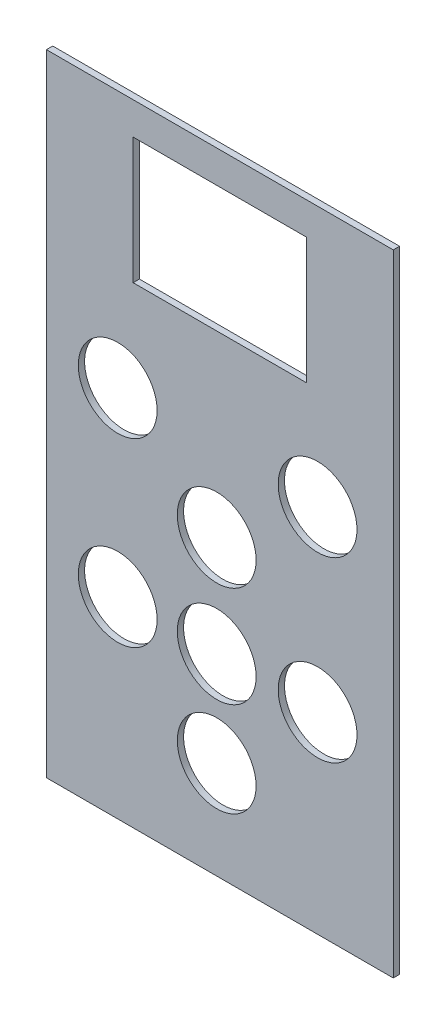
ISO-10303-21;
HEADER;
FILE_DESCRIPTION(('STEP AP214'),'2;1');
FILE_NAME('part.step','',(''),(''),'','','');
FILE_SCHEMA(('AUTOMOTIVE_DESIGN { 1 0 10303 214 1 1 1 1 }'));
ENDSEC;
DATA;
#1=APPLICATION_CONTEXT('core data for automotive mechanical design processes');
#2=APPLICATION_PROTOCOL_DEFINITION('international standard','automotive_design',2000,#1);
#3=PRODUCT_CONTEXT('',#1,'mechanical');
#4=PRODUCT('Part','Part','',(#3));
#5=PRODUCT_RELATED_PRODUCT_CATEGORY('part','',(#4));
#6=PRODUCT_DEFINITION_FORMATION('','',#4);
#7=PRODUCT_DEFINITION_CONTEXT('part definition',#1,'design');
#8=PRODUCT_DEFINITION('design','',#6,#7);
#9=PRODUCT_DEFINITION_SHAPE('','',#8);
#10=(LENGTH_UNIT() NAMED_UNIT(*) SI_UNIT(.MILLI.,.METRE.));
#11=(NAMED_UNIT(*) PLANE_ANGLE_UNIT() SI_UNIT($,.RADIAN.));
#12=(NAMED_UNIT(*) SI_UNIT($,.STERADIAN.) SOLID_ANGLE_UNIT());
#13=UNCERTAINTY_MEASURE_WITH_UNIT(LENGTH_MEASURE(1.E-05),#10,'distance_accuracy_value','');
#14=(GEOMETRIC_REPRESENTATION_CONTEXT(3) GLOBAL_UNCERTAINTY_ASSIGNED_CONTEXT((#13)) GLOBAL_UNIT_ASSIGNED_CONTEXT((#10,
#11,#12)) REPRESENTATION_CONTEXT('',''));
#15=CARTESIAN_POINT('',(0.,0.,0.));
#16=DIRECTION('',(0.,0.,1.));
#17=DIRECTION('',(1.,0.,0.));
#18=AXIS2_PLACEMENT_3D('',#15,#16,#17);
#19=CARTESIAN_POINT('',(0.,0.,1.));
#20=DIRECTION('',(0.,0.,1.));
#21=DIRECTION('',(1.,0.,0.));
#22=AXIS2_PLACEMENT_3D('',#19,#20,#21);
#23=PLANE('',#22);
#24=CARTESIAN_POINT('',(53.4181818181818,-38.2515151515152,1.));
#25=DIRECTION('',(0.,0.,1.));
#26=DIRECTION('',(1.,0.,0.));
#27=AXIS2_PLACEMENT_3D('',#24,#25,#26);
#28=CIRCLE('',#27,6.25);
#29=CARTESIAN_POINT('',(59.6681818181818,-38.2515151515152,1.));
#30=VERTEX_POINT('',#29);
#31=EDGE_CURVE('E302',#30,#30,#28,.T.);
#32=ORIENTED_EDGE('',*,*,#31,.F.);
#33=EDGE_LOOP('',(#32));
#34=FACE_BOUND('',#33,.T.);
#35=CARTESIAN_POINT('',(53.4181818181818,-66.4515151515152,1.));
#36=DIRECTION('',(0.,0.,1.));
#37=DIRECTION('',(1.,0.,0.));
#38=AXIS2_PLACEMENT_3D('',#35,#36,#37);
#39=CIRCLE('',#38,6.25000000000001);
#40=CARTESIAN_POINT('',(59.6681818181818,-66.4515151515152,1.));
#41=VERTEX_POINT('',#40);
#42=EDGE_CURVE('E318',#41,#41,#39,.T.);
#43=ORIENTED_EDGE('',*,*,#42,.F.);
#44=EDGE_LOOP('',(#43));
#45=FACE_BOUND('',#44,.T.);
#46=CARTESIAN_POINT('',(37.4181818181818,-66.4515151515152,1.));
#47=DIRECTION('',(0.,0.,1.));
#48=DIRECTION('',(1.,0.,0.));
#49=AXIS2_PLACEMENT_3D('',#46,#47,#48);
#50=CIRCLE('',#49,6.25000000000001);
#51=CARTESIAN_POINT('',(43.6681818181818,-66.4515151515152,1.));
#52=VERTEX_POINT('',#51);
#53=EDGE_CURVE('E140',#52,#52,#50,.T.);
#54=ORIENTED_EDGE('',*,*,#53,.F.);
#55=EDGE_LOOP('',(#54));
#56=FACE_BOUND('',#55,.T.);
#57=DIRECTION('',(0.,-1.,0.));
#58=VECTOR('',#57,1.);
#59=CARTESIAN_POINT('',(10.4181818181818,3.04848484848485,1.));
#60=LINE('',#59,#58);
#61=CARTESIAN_POINT('',(10.4181818181818,3.04848484848485,1.));
#62=VERTEX_POINT('',#61);
#63=CARTESIAN_POINT('',(10.4181818181818,-96.9515151515152,1.));
#64=VERTEX_POINT('',#63);
#65=EDGE_CURVE('E164',#62,#64,#60,.T.);
#66=ORIENTED_EDGE('',*,*,#65,.T.);
#67=DIRECTION('',(1.,0.,0.));
#68=VECTOR('',#67,1.);
#69=CARTESIAN_POINT('',(10.4181818181818,-96.9515151515152,1.));
#70=LINE('',#69,#68);
#71=CARTESIAN_POINT('',(65.4181818181818,-96.9515151515152,1.));
#72=VERTEX_POINT('',#71);
#73=EDGE_CURVE('E168',#64,#72,#70,.T.);
#74=ORIENTED_EDGE('',*,*,#73,.T.);
#75=DIRECTION('',(0.,1.,0.));
#76=VECTOR('',#75,1.);
#77=CARTESIAN_POINT('',(65.4181818181818,3.04848484848485,1.));
#78=LINE('',#77,#76);
#79=CARTESIAN_POINT('',(65.4181818181818,3.04848484848485,1.));
#80=VERTEX_POINT('',#79);
#81=EDGE_CURVE('E172',#72,#80,#78,.T.);
#82=ORIENTED_EDGE('',*,*,#81,.T.);
#83=DIRECTION('',(-1.,0.,0.));
#84=VECTOR('',#83,1.);
#85=CARTESIAN_POINT('',(10.4181818181818,3.04848484848485,1.));
#86=LINE('',#85,#84);
#87=EDGE_CURVE('E175',#80,#62,#86,.T.);
#88=ORIENTED_EDGE('',*,*,#87,.T.);
#89=EDGE_LOOP('',(#66,#74,#82,#88));
#90=FACE_BOUND('',#89,.T.);
#91=CARTESIAN_POINT('',(37.4181818181818,-81.4515151515152,1.));
#92=DIRECTION('',(0.,0.,1.));
#93=DIRECTION('',(1.,0.,0.));
#94=AXIS2_PLACEMENT_3D('',#91,#92,#93);
#95=CIRCLE('',#94,6.25000000000001);
#96=CARTESIAN_POINT('',(43.6681818181818,-81.4515151515152,1.));
#97=VERTEX_POINT('',#96);
#98=EDGE_CURVE('E156',#97,#97,#95,.T.);
#99=ORIENTED_EDGE('',*,*,#98,.F.);
#100=EDGE_LOOP('',(#99));
#101=FACE_BOUND('',#100,.T.);
#102=DIRECTION('',(-1.,0.,0.));
#103=VECTOR('',#102,1.);
#104=CARTESIAN_POINT('',(51.6681818181818,-2.08443428318356,1.));
#105=LINE('',#104,#103);
#106=CARTESIAN_POINT('',(51.6681818181818,-2.08443428318356,1.));
#107=VERTEX_POINT('',#106);
#108=CARTESIAN_POINT('',(24.1681818181818,-2.08443428318357,1.));
#109=VERTEX_POINT('',#108);
#110=EDGE_CURVE('E114',#107,#109,#105,.T.);
#111=ORIENTED_EDGE('',*,*,#110,.F.);
#112=DIRECTION('',(0.,1.,0.));
#113=VECTOR('',#112,1.);
#114=CARTESIAN_POINT('',(51.6681818181818,-2.08443428318356,1.));
#115=LINE('',#114,#113);
#116=CARTESIAN_POINT('',(51.6681818181818,-22.0844342831836,1.));
#117=VERTEX_POINT('',#116);
#118=EDGE_CURVE('E105',#117,#107,#115,.T.);
#119=ORIENTED_EDGE('',*,*,#118,.F.);
#120=DIRECTION('',(1.,0.,0.));
#121=VECTOR('',#120,1.);
#122=CARTESIAN_POINT('',(51.6681818181818,-22.0844342831836,1.));
#123=LINE('',#122,#121);
#124=CARTESIAN_POINT('',(24.1681818181818,-22.0844342831836,1.));
#125=VERTEX_POINT('',#124);
#126=EDGE_CURVE('E132',#125,#117,#123,.T.);
#127=ORIENTED_EDGE('',*,*,#126,.F.);
#128=DIRECTION('',(0.,-1.,0.));
#129=VECTOR('',#128,1.);
#130=CARTESIAN_POINT('',(24.1681818181818,-2.08443428318357,1.));
#131=LINE('',#130,#129);
#132=EDGE_CURVE('E128',#109,#125,#131,.T.);
#133=ORIENTED_EDGE('',*,*,#132,.F.);
#134=EDGE_LOOP('',(#111,#119,#127,#133));
#135=FACE_BOUND('',#134,.T.);
#136=CARTESIAN_POINT('',(21.7181818181818,-66.4515151515152,1.));
#137=DIRECTION('',(0.,0.,1.));
#138=DIRECTION('',(1.,0.,0.));
#139=AXIS2_PLACEMENT_3D('',#136,#137,#138);
#140=CIRCLE('',#139,6.25000000000001);
#141=CARTESIAN_POINT('',(27.9681818181818,-66.4515151515152,1.));
#142=VERTEX_POINT('',#141);
#143=EDGE_CURVE('E326',#142,#142,#140,.T.);
#144=ORIENTED_EDGE('',*,*,#143,.F.);
#145=EDGE_LOOP('',(#144));
#146=FACE_BOUND('',#145,.T.);
#147=CARTESIAN_POINT('',(37.4181818181818,-50.4515151515152,1.));
#148=DIRECTION('',(0.,0.,1.));
#149=DIRECTION('',(1.,0.,0.));
#150=AXIS2_PLACEMENT_3D('',#147,#148,#149);
#151=CIRCLE('',#150,6.25);
#152=CARTESIAN_POINT('',(43.6681818181818,-50.4515151515152,1.));
#153=VERTEX_POINT('',#152);
#154=EDGE_CURVE('E310',#153,#153,#151,.T.);
#155=ORIENTED_EDGE('',*,*,#154,.F.);
#156=EDGE_LOOP('',(#155));
#157=FACE_BOUND('',#156,.T.);
#158=CARTESIAN_POINT('',(21.7181818181818,-37.7515151515152,1.));
#159=DIRECTION('',(0.,0.,1.));
#160=DIRECTION('',(1.,0.,0.));
#161=AXIS2_PLACEMENT_3D('',#158,#159,#160);
#162=CIRCLE('',#161,6.25);
#163=CARTESIAN_POINT('',(27.9681818181818,-37.7515151515152,1.));
#164=VERTEX_POINT('',#163);
#165=EDGE_CURVE('E291',#164,#164,#162,.T.);
#166=ORIENTED_EDGE('',*,*,#165,.F.);
#167=EDGE_LOOP('',(#166));
#168=FACE_BOUND('',#167,.T.);
#169=ADVANCED_FACE('F39',(#34,#45,#56,#90,#101,#135,#146,#157,#168),#23,.T.);
#170=CARTESIAN_POINT('',(0.,0.,0.));
#171=DIRECTION('',(0.,0.,1.));
#172=DIRECTION('',(1.,0.,0.));
#173=AXIS2_PLACEMENT_3D('',#170,#171,#172);
#174=PLANE('',#173);
#175=CARTESIAN_POINT('',(37.4181818181818,-81.4515151515152,0.));
#176=DIRECTION('',(0.,0.,1.));
#177=DIRECTION('',(1.,0.,0.));
#178=AXIS2_PLACEMENT_3D('',#175,#176,#177);
#179=CIRCLE('',#178,6.25000000000001);
#180=CARTESIAN_POINT('',(43.6681818181818,-81.4515151515152,0.));
#181=VERTEX_POINT('',#180);
#182=EDGE_CURVE('E123',#181,#181,#179,.T.);
#183=ORIENTED_EDGE('',*,*,#182,.T.);
#184=EDGE_LOOP('',(#183));
#185=FACE_BOUND('',#184,.T.);
#186=DIRECTION('',(0.,-1.,0.));
#187=VECTOR('',#186,1.);
#188=CARTESIAN_POINT('',(10.4181818181818,3.04848484848485,0.));
#189=LINE('',#188,#187);
#190=CARTESIAN_POINT('',(10.4181818181818,3.04848484848485,0.));
#191=VERTEX_POINT('',#190);
#192=CARTESIAN_POINT('',(10.4181818181818,-96.9515151515152,0.));
#193=VERTEX_POINT('',#192);
#194=EDGE_CURVE('E160',#191,#193,#189,.T.);
#195=ORIENTED_EDGE('',*,*,#194,.F.);
#196=DIRECTION('',(-1.,0.,0.));
#197=VECTOR('',#196,1.);
#198=CARTESIAN_POINT('',(10.4181818181818,3.04848484848485,0.));
#199=LINE('',#198,#197);
#200=CARTESIAN_POINT('',(65.4181818181818,3.04848484848485,0.));
#201=VERTEX_POINT('',#200);
#202=EDGE_CURVE('E169',#201,#191,#199,.T.);
#203=ORIENTED_EDGE('',*,*,#202,.F.);
#204=DIRECTION('',(0.,1.,0.));
#205=VECTOR('',#204,1.);
#206=CARTESIAN_POINT('',(65.4181818181818,3.04848484848485,0.));
#207=LINE('',#206,#205);
#208=CARTESIAN_POINT('',(65.4181818181818,-96.9515151515152,0.));
#209=VERTEX_POINT('',#208);
#210=EDGE_CURVE('E185',#209,#201,#207,.T.);
#211=ORIENTED_EDGE('',*,*,#210,.F.);
#212=DIRECTION('',(1.,0.,0.));
#213=VECTOR('',#212,1.);
#214=CARTESIAN_POINT('',(10.4181818181818,-96.9515151515152,0.));
#215=LINE('',#214,#213);
#216=EDGE_CURVE('E182',#193,#209,#215,.T.);
#217=ORIENTED_EDGE('',*,*,#216,.F.);
#218=EDGE_LOOP('',(#195,#203,#211,#217));
#219=FACE_BOUND('',#218,.T.);
#220=DIRECTION('',(0.,1.,0.));
#221=VECTOR('',#220,1.);
#222=CARTESIAN_POINT('',(51.6681818181818,-2.08443428318356,0.));
#223=LINE('',#222,#221);
#224=CARTESIAN_POINT('',(51.6681818181818,-22.0844342831836,0.));
#225=VERTEX_POINT('',#224);
#226=CARTESIAN_POINT('',(51.6681818181818,-2.08443428318356,0.));
#227=VERTEX_POINT('',#226);
#228=EDGE_CURVE('E63',#225,#227,#223,.T.);
#229=ORIENTED_EDGE('',*,*,#228,.T.);
#230=DIRECTION('',(-1.,0.,0.));
#231=VECTOR('',#230,1.);
#232=CARTESIAN_POINT('',(51.6681818181818,-2.08443428318356,0.));
#233=LINE('',#232,#231);
#234=CARTESIAN_POINT('',(24.1681818181818,-2.08443428318357,0.));
#235=VERTEX_POINT('',#234);
#236=EDGE_CURVE('E121',#227,#235,#233,.T.);
#237=ORIENTED_EDGE('',*,*,#236,.T.);
#238=DIRECTION('',(0.,-1.,0.));
#239=VECTOR('',#238,1.);
#240=CARTESIAN_POINT('',(24.1681818181818,-2.08443428318357,0.));
#241=LINE('',#240,#239);
#242=CARTESIAN_POINT('',(24.1681818181818,-22.0844342831836,0.));
#243=VERTEX_POINT('',#242);
#244=EDGE_CURVE('E143',#235,#243,#241,.T.);
#245=ORIENTED_EDGE('',*,*,#244,.T.);
#246=DIRECTION('',(1.,0.,0.));
#247=VECTOR('',#246,1.);
#248=CARTESIAN_POINT('',(51.6681818181818,-22.0844342831836,0.));
#249=LINE('',#248,#247);
#250=EDGE_CURVE('E115',#243,#225,#249,.T.);
#251=ORIENTED_EDGE('',*,*,#250,.T.);
#252=EDGE_LOOP('',(#229,#237,#245,#251));
#253=FACE_BOUND('',#252,.T.);
#254=CARTESIAN_POINT('',(37.4181818181818,-66.4515151515152,0.));
#255=DIRECTION('',(0.,0.,1.));
#256=DIRECTION('',(1.,0.,0.));
#257=AXIS2_PLACEMENT_3D('',#254,#255,#256);
#258=CIRCLE('',#257,6.25000000000001);
#259=CARTESIAN_POINT('',(43.6681818181818,-66.4515151515152,0.));
#260=VERTEX_POINT('',#259);
#261=EDGE_CURVE('E330',#260,#260,#258,.T.);
#262=ORIENTED_EDGE('',*,*,#261,.T.);
#263=EDGE_LOOP('',(#262));
#264=FACE_BOUND('',#263,.T.);
#265=CARTESIAN_POINT('',(21.7181818181818,-66.4515151515152,0.));
#266=DIRECTION('',(0.,0.,1.));
#267=DIRECTION('',(1.,0.,0.));
#268=AXIS2_PLACEMENT_3D('',#265,#266,#267);
#269=CIRCLE('',#268,6.25000000000001);
#270=CARTESIAN_POINT('',(27.9681818181818,-66.4515151515152,0.));
#271=VERTEX_POINT('',#270);
#272=EDGE_CURVE('E322',#271,#271,#269,.T.);
#273=ORIENTED_EDGE('',*,*,#272,.T.);
#274=EDGE_LOOP('',(#273));
#275=FACE_BOUND('',#274,.T.);
#276=CARTESIAN_POINT('',(53.4181818181818,-66.4515151515152,0.));
#277=DIRECTION('',(0.,0.,1.));
#278=DIRECTION('',(1.,0.,0.));
#279=AXIS2_PLACEMENT_3D('',#276,#277,#278);
#280=CIRCLE('',#279,6.25000000000001);
#281=CARTESIAN_POINT('',(59.6681818181818,-66.4515151515152,0.));
#282=VERTEX_POINT('',#281);
#283=EDGE_CURVE('E314',#282,#282,#280,.T.);
#284=ORIENTED_EDGE('',*,*,#283,.T.);
#285=EDGE_LOOP('',(#284));
#286=FACE_BOUND('',#285,.T.);
#287=CARTESIAN_POINT('',(37.4181818181818,-50.4515151515152,0.));
#288=DIRECTION('',(0.,0.,1.));
#289=DIRECTION('',(1.,0.,0.));
#290=AXIS2_PLACEMENT_3D('',#287,#288,#289);
#291=CIRCLE('',#290,6.25);
#292=CARTESIAN_POINT('',(43.6681818181818,-50.4515151515152,0.));
#293=VERTEX_POINT('',#292);
#294=EDGE_CURVE('E306',#293,#293,#291,.T.);
#295=ORIENTED_EDGE('',*,*,#294,.T.);
#296=EDGE_LOOP('',(#295));
#297=FACE_BOUND('',#296,.T.);
#298=CARTESIAN_POINT('',(53.4181818181818,-38.2515151515152,0.));
#299=DIRECTION('',(0.,0.,1.));
#300=DIRECTION('',(1.,0.,0.));
#301=AXIS2_PLACEMENT_3D('',#298,#299,#300);
#302=CIRCLE('',#301,6.25);
#303=CARTESIAN_POINT('',(59.6681818181818,-38.2515151515152,0.));
#304=VERTEX_POINT('',#303);
#305=EDGE_CURVE('E299',#304,#304,#302,.T.);
#306=ORIENTED_EDGE('',*,*,#305,.T.);
#307=EDGE_LOOP('',(#306));
#308=FACE_BOUND('',#307,.T.);
#309=CARTESIAN_POINT('',(21.7181818181818,-37.7515151515152,0.));
#310=DIRECTION('',(0.,0.,1.));
#311=DIRECTION('',(1.,0.,0.));
#312=AXIS2_PLACEMENT_3D('',#309,#310,#311);
#313=CIRCLE('',#312,6.25);
#314=CARTESIAN_POINT('',(27.9681818181818,-37.7515151515152,0.));
#315=VERTEX_POINT('',#314);
#316=EDGE_CURVE('E294',#315,#315,#313,.T.);
#317=ORIENTED_EDGE('',*,*,#316,.T.);
#318=EDGE_LOOP('',(#317));
#319=FACE_BOUND('',#318,.T.);
#320=ADVANCED_FACE('F208',(#185,#219,#253,#264,#275,#286,#297,#308,#319),#174,.F.);
#321=CARTESIAN_POINT('',(10.4181818181818,3.04848484848485,1.));
#322=DIRECTION('',(1.,0.,0.));
#323=DIRECTION('',(0.,1.,0.));
#324=AXIS2_PLACEMENT_3D('',#321,#322,#323);
#325=PLANE('',#324);
#326=ORIENTED_EDGE('',*,*,#194,.T.);
#327=DIRECTION('',(0.,0.,-1.));
#328=VECTOR('',#327,1.);
#329=CARTESIAN_POINT('',(10.4181818181818,-96.9515151515152,1.));
#330=LINE('',#329,#328);
#331=EDGE_CURVE('E11',#64,#193,#330,.T.);
#332=ORIENTED_EDGE('',*,*,#331,.F.);
#333=ORIENTED_EDGE('',*,*,#65,.F.);
#334=DIRECTION('',(0.,0.,-1.));
#335=VECTOR('',#334,1.);
#336=CARTESIAN_POINT('',(10.4181818181818,3.04848484848485,1.));
#337=LINE('',#336,#335);
#338=EDGE_CURVE('E178',#62,#191,#337,.T.);
#339=ORIENTED_EDGE('',*,*,#338,.T.);
#340=EDGE_LOOP('',(#326,#332,#333,#339));
#341=FACE_BOUND('',#340,.T.);
#342=ADVANCED_FACE('F41',(#341),#325,.F.);
#343=CARTESIAN_POINT('',(10.4181818181818,-96.9515151515152,1.));
#344=DIRECTION('',(0.,1.,0.));
#345=DIRECTION('',(0.,0.,1.));
#346=AXIS2_PLACEMENT_3D('',#343,#344,#345);
#347=PLANE('',#346);
#348=ORIENTED_EDGE('',*,*,#216,.T.);
#349=DIRECTION('',(0.,0.,-1.));
#350=VECTOR('',#349,1.);
#351=CARTESIAN_POINT('',(65.4181818181818,-96.9515151515152,1.));
#352=LINE('',#351,#350);
#353=EDGE_CURVE('E48',#72,#209,#352,.T.);
#354=ORIENTED_EDGE('',*,*,#353,.F.);
#355=ORIENTED_EDGE('',*,*,#73,.F.);
#356=ORIENTED_EDGE('',*,*,#331,.T.);
#357=EDGE_LOOP('',(#348,#354,#355,#356));
#358=FACE_BOUND('',#357,.T.);
#359=ADVANCED_FACE('F219',(#358),#347,.F.);
#360=CARTESIAN_POINT('',(65.4181818181818,3.04848484848485,1.));
#361=DIRECTION('',(-1.,0.,0.));
#362=DIRECTION('',(0.,-1.,0.));
#363=AXIS2_PLACEMENT_3D('',#360,#361,#362);
#364=PLANE('',#363);
#365=ORIENTED_EDGE('',*,*,#210,.T.);
#366=DIRECTION('',(0.,0.,-1.));
#367=VECTOR('',#366,1.);
#368=CARTESIAN_POINT('',(65.4181818181818,3.04848484848485,1.));
#369=LINE('',#368,#367);
#370=EDGE_CURVE('E193',#80,#201,#369,.T.);
#371=ORIENTED_EDGE('',*,*,#370,.F.);
#372=ORIENTED_EDGE('',*,*,#81,.F.);
#373=ORIENTED_EDGE('',*,*,#353,.T.);
#374=EDGE_LOOP('',(#365,#371,#372,#373));
#375=FACE_BOUND('',#374,.T.);
#376=ADVANCED_FACE('F202',(#375),#364,.F.);
#377=CARTESIAN_POINT('',(10.4181818181818,3.04848484848485,1.));
#378=DIRECTION('',(0.,-1.,0.));
#379=DIRECTION('',(0.,0.,-1.));
#380=AXIS2_PLACEMENT_3D('',#377,#378,#379);
#381=PLANE('',#380);
#382=ORIENTED_EDGE('',*,*,#202,.T.);
#383=ORIENTED_EDGE('',*,*,#338,.F.);
#384=ORIENTED_EDGE('',*,*,#87,.F.);
#385=ORIENTED_EDGE('',*,*,#370,.T.);
#386=EDGE_LOOP('',(#382,#383,#384,#385));
#387=FACE_BOUND('',#386,.T.);
#388=ADVANCED_FACE('F212',(#387),#381,.F.);
#389=CARTESIAN_POINT('',(37.4181818181818,-81.4515151515152,1.));
#390=DIRECTION('',(0.,0.,-1.));
#391=DIRECTION('',(-1.,0.,0.));
#392=AXIS2_PLACEMENT_3D('',#389,#390,#391);
#393=CYLINDRICAL_SURFACE('',#392,6.25000000000001);
#394=ORIENTED_EDGE('',*,*,#98,.T.);
#395=EDGE_LOOP('',(#394));
#396=FACE_BOUND('',#395,.T.);
#397=ORIENTED_EDGE('',*,*,#182,.F.);
#398=EDGE_LOOP('',(#397));
#399=FACE_BOUND('',#398,.T.);
#400=ADVANCED_FACE('F237',(#396,#399),#393,.F.);
#401=CARTESIAN_POINT('',(51.6681818181818,-2.08443428318356,1.));
#402=DIRECTION('',(-1.,0.,0.));
#403=DIRECTION('',(0.,0.,1.));
#404=AXIS2_PLACEMENT_3D('',#401,#402,#403);
#405=PLANE('',#404);
#406=ORIENTED_EDGE('',*,*,#228,.F.);
#407=DIRECTION('',(0.,0.,-1.));
#408=VECTOR('',#407,1.);
#409=CARTESIAN_POINT('',(51.6681818181818,-22.0844342831836,1.));
#410=LINE('',#409,#408);
#411=EDGE_CURVE('E109',#117,#225,#410,.T.);
#412=ORIENTED_EDGE('',*,*,#411,.F.);
#413=ORIENTED_EDGE('',*,*,#118,.T.);
#414=DIRECTION('',(0.,0.,-1.));
#415=VECTOR('',#414,1.);
#416=CARTESIAN_POINT('',(51.6681818181818,-2.08443428318356,1.));
#417=LINE('',#416,#415);
#418=EDGE_CURVE('E108',#107,#227,#417,.T.);
#419=ORIENTED_EDGE('',*,*,#418,.T.);
#420=EDGE_LOOP('',(#406,#412,#413,#419));
#421=FACE_BOUND('',#420,.T.);
#422=ADVANCED_FACE('F107',(#421),#405,.T.);
#423=CARTESIAN_POINT('',(51.6681818181818,-2.08443428318356,1.));
#424=DIRECTION('',(0.,-1.,0.));
#425=DIRECTION('',(1.,0.,0.));
#426=AXIS2_PLACEMENT_3D('',#423,#424,#425);
#427=PLANE('',#426);
#428=ORIENTED_EDGE('',*,*,#236,.F.);
#429=ORIENTED_EDGE('',*,*,#418,.F.);
#430=ORIENTED_EDGE('',*,*,#110,.T.);
#431=DIRECTION('',(0.,0.,-1.));
#432=VECTOR('',#431,1.);
#433=CARTESIAN_POINT('',(24.1681818181818,-2.08443428318357,1.));
#434=LINE('',#433,#432);
#435=EDGE_CURVE('E124',#109,#235,#434,.T.);
#436=ORIENTED_EDGE('',*,*,#435,.T.);
#437=EDGE_LOOP('',(#428,#429,#430,#436));
#438=FACE_BOUND('',#437,.T.);
#439=ADVANCED_FACE('F118',(#438),#427,.T.);
#440=CARTESIAN_POINT('',(24.1681818181818,-2.08443428318357,1.));
#441=DIRECTION('',(1.,0.,0.));
#442=DIRECTION('',(0.,1.,0.));
#443=AXIS2_PLACEMENT_3D('',#440,#441,#442);
#444=PLANE('',#443);
#445=ORIENTED_EDGE('',*,*,#244,.F.);
#446=ORIENTED_EDGE('',*,*,#435,.F.);
#447=ORIENTED_EDGE('',*,*,#132,.T.);
#448=DIRECTION('',(0.,0.,-1.));
#449=VECTOR('',#448,1.);
#450=CARTESIAN_POINT('',(24.1681818181818,-22.0844342831836,1.));
#451=LINE('',#450,#449);
#452=EDGE_CURVE('E55',#125,#243,#451,.T.);
#453=ORIENTED_EDGE('',*,*,#452,.T.);
#454=EDGE_LOOP('',(#445,#446,#447,#453));
#455=FACE_BOUND('',#454,.T.);
#456=ADVANCED_FACE('F254',(#455),#444,.T.);
#457=CARTESIAN_POINT('',(51.6681818181818,-22.0844342831836,1.));
#458=DIRECTION('',(0.,1.,0.));
#459=DIRECTION('',(-1.,0.,0.));
#460=AXIS2_PLACEMENT_3D('',#457,#458,#459);
#461=PLANE('',#460);
#462=ORIENTED_EDGE('',*,*,#250,.F.);
#463=ORIENTED_EDGE('',*,*,#452,.F.);
#464=ORIENTED_EDGE('',*,*,#126,.T.);
#465=ORIENTED_EDGE('',*,*,#411,.T.);
#466=EDGE_LOOP('',(#462,#463,#464,#465));
#467=FACE_BOUND('',#466,.T.);
#468=ADVANCED_FACE('F259',(#467),#461,.T.);
#469=CARTESIAN_POINT('',(37.4181818181818,-66.4515151515152,1.));
#470=DIRECTION('',(0.,0.,-1.));
#471=DIRECTION('',(-1.,0.,0.));
#472=AXIS2_PLACEMENT_3D('',#469,#470,#471);
#473=CYLINDRICAL_SURFACE('',#472,6.25000000000001);
#474=ORIENTED_EDGE('',*,*,#53,.T.);
#475=EDGE_LOOP('',(#474));
#476=FACE_BOUND('',#475,.T.);
#477=ORIENTED_EDGE('',*,*,#261,.F.);
#478=EDGE_LOOP('',(#477));
#479=FACE_BOUND('',#478,.T.);
#480=ADVANCED_FACE('F263',(#476,#479),#473,.F.);
#481=CARTESIAN_POINT('',(21.7181818181818,-66.4515151515152,1.));
#482=DIRECTION('',(0.,0.,-1.));
#483=DIRECTION('',(-1.,0.,0.));
#484=AXIS2_PLACEMENT_3D('',#481,#482,#483);
#485=CYLINDRICAL_SURFACE('',#484,6.25000000000001);
#486=ORIENTED_EDGE('',*,*,#143,.T.);
#487=EDGE_LOOP('',(#486));
#488=FACE_BOUND('',#487,.T.);
#489=ORIENTED_EDGE('',*,*,#272,.F.);
#490=EDGE_LOOP('',(#489));
#491=FACE_BOUND('',#490,.T.);
#492=ADVANCED_FACE('F266',(#488,#491),#485,.F.);
#493=CARTESIAN_POINT('',(53.4181818181818,-66.4515151515152,1.));
#494=DIRECTION('',(0.,0.,-1.));
#495=DIRECTION('',(-1.,0.,0.));
#496=AXIS2_PLACEMENT_3D('',#493,#494,#495);
#497=CYLINDRICAL_SURFACE('',#496,6.25000000000001);
#498=ORIENTED_EDGE('',*,*,#42,.T.);
#499=EDGE_LOOP('',(#498));
#500=FACE_BOUND('',#499,.T.);
#501=ORIENTED_EDGE('',*,*,#283,.F.);
#502=EDGE_LOOP('',(#501));
#503=FACE_BOUND('',#502,.T.);
#504=ADVANCED_FACE('F270',(#500,#503),#497,.F.);
#505=CARTESIAN_POINT('',(37.4181818181818,-50.4515151515152,1.));
#506=DIRECTION('',(0.,0.,-1.));
#507=DIRECTION('',(-1.,0.,0.));
#508=AXIS2_PLACEMENT_3D('',#505,#506,#507);
#509=CYLINDRICAL_SURFACE('',#508,6.25);
#510=ORIENTED_EDGE('',*,*,#154,.T.);
#511=EDGE_LOOP('',(#510));
#512=FACE_BOUND('',#511,.T.);
#513=ORIENTED_EDGE('',*,*,#294,.F.);
#514=EDGE_LOOP('',(#513));
#515=FACE_BOUND('',#514,.T.);
#516=ADVANCED_FACE('F274',(#512,#515),#509,.F.);
#517=CARTESIAN_POINT('',(53.4181818181818,-38.2515151515152,1.));
#518=DIRECTION('',(0.,0.,-1.));
#519=DIRECTION('',(-1.,0.,0.));
#520=AXIS2_PLACEMENT_3D('',#517,#518,#519);
#521=CYLINDRICAL_SURFACE('',#520,6.25);
#522=ORIENTED_EDGE('',*,*,#31,.T.);
#523=EDGE_LOOP('',(#522));
#524=FACE_BOUND('',#523,.T.);
#525=ORIENTED_EDGE('',*,*,#305,.F.);
#526=EDGE_LOOP('',(#525));
#527=FACE_BOUND('',#526,.T.);
#528=ADVANCED_FACE('F278',(#524,#527),#521,.F.);
#529=CARTESIAN_POINT('',(21.7181818181818,-37.7515151515152,1.));
#530=DIRECTION('',(0.,0.,-1.));
#531=DIRECTION('',(-1.,0.,0.));
#532=AXIS2_PLACEMENT_3D('',#529,#530,#531);
#533=CYLINDRICAL_SURFACE('',#532,6.25);
#534=ORIENTED_EDGE('',*,*,#165,.T.);
#535=EDGE_LOOP('',(#534));
#536=FACE_BOUND('',#535,.T.);
#537=ORIENTED_EDGE('',*,*,#316,.F.);
#538=EDGE_LOOP('',(#537));
#539=FACE_BOUND('',#538,.T.);
#540=ADVANCED_FACE('F282',(#536,#539),#533,.F.);
#541=CLOSED_SHELL('',(#169,#320,#342,#359,#376,#388,#400,#422,#439,#456,#468,#480,#492,#504,
#516,#528,#540));
#542=MANIFOLD_SOLID_BREP('B2',#541);
#543=ADVANCED_BREP_SHAPE_REPRESENTATION('',(#18,#542),#14);
#544=SHAPE_DEFINITION_REPRESENTATION(#9,#543);
ENDSEC;
END-ISO-10303-21;
